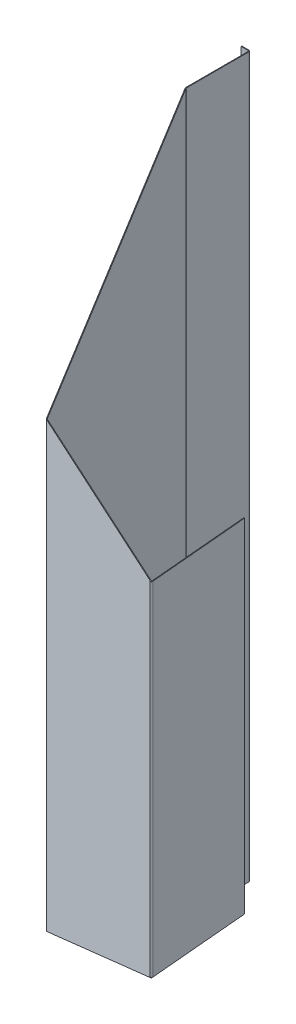
ISO-10303-21;
HEADER;
FILE_DESCRIPTION(('STEP AP214'),'2;1');
FILE_NAME('part.step','',(''),(''),'','','');
FILE_SCHEMA(('AUTOMOTIVE_DESIGN { 1 0 10303 214 1 1 1 1 }'));
ENDSEC;
DATA;
#1=APPLICATION_CONTEXT('core data for automotive mechanical design processes');
#2=APPLICATION_PROTOCOL_DEFINITION('international standard','automotive_design',2000,#1);
#3=PRODUCT_CONTEXT('',#1,'mechanical');
#4=PRODUCT('Part','Part','',(#3));
#5=PRODUCT_RELATED_PRODUCT_CATEGORY('part','',(#4));
#6=PRODUCT_DEFINITION_FORMATION('','',#4);
#7=PRODUCT_DEFINITION_CONTEXT('part definition',#1,'design');
#8=PRODUCT_DEFINITION('design','',#6,#7);
#9=PRODUCT_DEFINITION_SHAPE('','',#8);
#10=(LENGTH_UNIT() NAMED_UNIT(*) SI_UNIT(.MILLI.,.METRE.));
#11=(NAMED_UNIT(*) PLANE_ANGLE_UNIT() SI_UNIT($,.RADIAN.));
#12=(NAMED_UNIT(*) SI_UNIT($,.STERADIAN.) SOLID_ANGLE_UNIT());
#13=UNCERTAINTY_MEASURE_WITH_UNIT(LENGTH_MEASURE(1.E-05),#10,'distance_accuracy_value','');
#14=(GEOMETRIC_REPRESENTATION_CONTEXT(3) GLOBAL_UNCERTAINTY_ASSIGNED_CONTEXT((#13)) GLOBAL_UNIT_ASSIGNED_CONTEXT((#10,
#11,#12)) REPRESENTATION_CONTEXT('',''));
#15=CARTESIAN_POINT('',(0.,0.,0.));
#16=DIRECTION('',(0.,0.,1.));
#17=DIRECTION('',(1.,0.,0.));
#18=AXIS2_PLACEMENT_3D('',#15,#16,#17);
#19=CARTESIAN_POINT('',(-75.030539026034,0.,-1709.11553850912));
#20=DIRECTION('',(0.,-1.,0.));
#21=DIRECTION('',(0.,0.,-1.));
#22=AXIS2_PLACEMENT_3D('',#19,#20,#21);
#23=PLANE('',#22);
#24=DIRECTION('',(0.,0.,1.));
#25=VECTOR('',#24,1.);
#26=CARTESIAN_POINT('',(-75.1270308327766,0.,-1784.52170915387));
#27=LINE('',#26,#25);
#28=CARTESIAN_POINT('',(-75.1270308327765,0.,-1782.92170915387));
#29=VERTEX_POINT('',#28);
#30=CARTESIAN_POINT('',(-75.1270308327766,0.,-1709.66277073844));
#31=VERTEX_POINT('',#30);
#32=EDGE_CURVE('E418',#29,#31,#27,.T.);
#33=ORIENTED_EDGE('',*,*,#32,.F.);
#34=DIRECTION('',(1.,0.,0.));
#35=VECTOR('',#34,1.);
#36=CARTESIAN_POINT('',(-75.1270308327765,0.,-1782.92170915387));
#37=LINE('',#36,#35);
#38=CARTESIAN_POINT('',(-74.3270308327765,0.,-1782.92170915387));
#39=VERTEX_POINT('',#38);
#40=EDGE_CURVE('E279',#29,#39,#37,.T.);
#41=ORIENTED_EDGE('',*,*,#40,.T.);
#42=DIRECTION('',(0.,0.,1.));
#43=VECTOR('',#42,1.);
#44=CARTESIAN_POINT('',(-74.3270308327766,0.,-1784.52170915387));
#45=LINE('',#44,#43);
#46=CARTESIAN_POINT('',(-74.3270308327766,0.,-1709.66277073844));
#47=VERTEX_POINT('',#46);
#48=EDGE_CURVE('E416',#39,#47,#45,.T.);
#49=ORIENTED_EDGE('',*,*,#48,.T.);
#50=DIRECTION('',(-1.,0.,0.));
#51=VECTOR('',#50,1.);
#52=CARTESIAN_POINT('',(-74.3270308327766,0.,-1709.66277073844));
#53=LINE('',#52,#51);
#54=EDGE_CURVE('E447',#47,#31,#53,.T.);
#55=ORIENTED_EDGE('',*,*,#54,.T.);
#56=EDGE_LOOP('',(#33,#41,#49,#55));
#57=FACE_BOUND('',#56,.T.);
#58=ADVANCED_FACE('F74',(#57),#23,.T.);
#59=CARTESIAN_POINT('',(-74.3270308327766,840.,-1784.52170915387));
#60=DIRECTION('',(1.,0.,0.));
#61=DIRECTION('',(0.,0.,-1.));
#62=AXIS2_PLACEMENT_3D('',#59,#60,#61);
#63=PLANE('',#62);
#64=ORIENTED_EDGE('',*,*,#48,.F.);
#65=DIRECTION('',(0.,-1.,0.));
#66=VECTOR('',#65,1.);
#67=CARTESIAN_POINT('',(-74.3270308327765,1.11022302462516E-13,-1782.92170915387));
#68=LINE('',#67,#66);
#69=CARTESIAN_POINT('',(-74.3270308327766,840.,-1782.92170915387));
#70=VERTEX_POINT('',#69);
#71=EDGE_CURVE('E272',#39,#70,#68,.F.);
#72=ORIENTED_EDGE('',*,*,#71,.T.);
#73=DIRECTION('',(0.,0.,1.));
#74=VECTOR('',#73,1.);
#75=CARTESIAN_POINT('',(-74.3270308327766,840.,-1784.52170915387));
#76=LINE('',#75,#74);
#77=CARTESIAN_POINT('',(-74.3270308327766,840.,-1709.66277073844));
#78=VERTEX_POINT('',#77);
#79=EDGE_CURVE('E405',#70,#78,#76,.T.);
#80=ORIENTED_EDGE('',*,*,#79,.T.);
#81=DIRECTION('',(0.,-1.,0.));
#82=VECTOR('',#81,1.);
#83=CARTESIAN_POINT('',(-74.3270308327766,840.,-1709.66277073844));
#84=LINE('',#83,#82);
#85=EDGE_CURVE('E433',#78,#47,#84,.T.);
#86=ORIENTED_EDGE('',*,*,#85,.T.);
#87=EDGE_LOOP('',(#64,#72,#80,#86));
#88=FACE_BOUND('',#87,.T.);
#89=ADVANCED_FACE('F488',(#88),#63,.T.);
#90=CARTESIAN_POINT('',(-75.1270308327766,840.,-1784.52170915387));
#91=DIRECTION('',(1.,0.,0.));
#92=DIRECTION('',(0.,0.,-1.));
#93=AXIS2_PLACEMENT_3D('',#90,#91,#92);
#94=PLANE('',#93);
#95=DIRECTION('',(0.,-1.,0.));
#96=VECTOR('',#95,1.);
#97=CARTESIAN_POINT('',(-75.1270308327765,1.11022302462516E-13,-1782.92170915387));
#98=LINE('',#97,#96);
#99=CARTESIAN_POINT('',(-75.1270308327765,840.,-1782.92170915387));
#100=VERTEX_POINT('',#99);
#101=EDGE_CURVE('E285',#29,#100,#98,.F.);
#102=ORIENTED_EDGE('',*,*,#101,.F.);
#103=ORIENTED_EDGE('',*,*,#32,.T.);
#104=DIRECTION('',(0.,-1.,0.));
#105=VECTOR('',#104,1.);
#106=CARTESIAN_POINT('',(-75.1270308327766,840.,-1709.66277073844));
#107=LINE('',#106,#105);
#108=CARTESIAN_POINT('',(-75.1270308327766,840.,-1709.66277073844));
#109=VERTEX_POINT('',#108);
#110=EDGE_CURVE('E430',#109,#31,#107,.T.);
#111=ORIENTED_EDGE('',*,*,#110,.F.);
#112=DIRECTION('',(0.,0.,1.));
#113=VECTOR('',#112,1.);
#114=CARTESIAN_POINT('',(-75.1270308327766,840.,-1784.52170915387));
#115=LINE('',#114,#113);
#116=EDGE_CURVE('E408',#100,#109,#115,.T.);
#117=ORIENTED_EDGE('',*,*,#116,.F.);
#118=EDGE_LOOP('',(#102,#103,#111,#117));
#119=FACE_BOUND('',#118,.T.);
#120=ADVANCED_FACE('F496',(#119),#94,.F.);
#121=CARTESIAN_POINT('',(19.176253387553,840.,-1454.9625906338));
#122=DIRECTION('',(0.,-1.,0.));
#123=DIRECTION('',(0.,0.,-1.));
#124=AXIS2_PLACEMENT_3D('',#121,#122,#123);
#125=PLANE('',#124);
#126=DIRECTION('',(1.,2.7755575615632E-13,0.));
#127=VECTOR('',#126,1.);
#128=CARTESIAN_POINT('',(-75.1270308327765,840.,-1782.92170915387));
#129=LINE('',#128,#127);
#130=EDGE_CURVE('E290',#100,#70,#129,.T.);
#131=ORIENTED_EDGE('',*,*,#130,.F.);
#132=ORIENTED_EDGE('',*,*,#116,.T.);
#133=DIRECTION('',(1.,0.,0.));
#134=VECTOR('',#133,1.);
#135=CARTESIAN_POINT('',(-75.1270308327766,840.,-1709.66277073844));
#136=LINE('',#135,#134);
#137=EDGE_CURVE('E449',#109,#78,#136,.T.);
#138=ORIENTED_EDGE('',*,*,#137,.T.);
#139=ORIENTED_EDGE('',*,*,#79,.F.);
#140=EDGE_LOOP('',(#131,#132,#138,#139));
#141=FACE_BOUND('',#140,.T.);
#142=ADVANCED_FACE('F490',(#141),#125,.F.);
#143=CARTESIAN_POINT('',(185.672969167223,219.705065737132,-1409.52170915387));
#144=DIRECTION('',(0.,1.,0.));
#145=DIRECTION('',(0.,0.,1.));
#146=AXIS2_PLACEMENT_3D('',#143,#144,#145);
#147=PLANE('',#146);
#148=DIRECTION('',(-0.965925826289069,0.,-0.258819045102519));
#149=VECTOR('',#148,1.);
#150=CARTESIAN_POINT('',(185.672969167223,219.705065737132,-1409.52170915387));
#151=LINE('',#150,#149);
#152=CARTESIAN_POINT('',(185.672969167223,219.705065737132,-1409.52170915387));
#153=VERTEX_POINT('',#152);
#154=CARTESIAN_POINT('',(185.085473783066,219.705065737132,-1409.67912806762));
#155=VERTEX_POINT('',#154);
#156=EDGE_CURVE('E343',#153,#155,#151,.T.);
#157=ORIENTED_EDGE('',*,*,#156,.T.);
#158=CARTESIAN_POINT('',(183.954102933167,219.705065737132,-1410.81049891751));
#159=DIRECTION('',(0.,-1.,0.));
#160=DIRECTION('',(0.,0.,-1.));
#161=AXIS2_PLACEMENT_3D('',#158,#159,#160);
#162=CIRCLE('',#161,1.60000000000001);
#163=CARTESIAN_POINT('',(183.539992461003,219.705065737132,-1409.26501759545));
#164=VERTEX_POINT('',#163);
#165=EDGE_CURVE('E13',#155,#164,#162,.T.);
#166=ORIENTED_EDGE('',*,*,#165,.T.);
#167=DIRECTION('',(0.965925826289068,0.,0.258819045102521));
#168=VECTOR('',#167,1.);
#169=CARTESIAN_POINT('',(18.3598795886345,219.705065737132,-1453.52489544528));
#170=LINE('',#169,#168);
#171=CARTESIAN_POINT('',(185.465913931141,219.705065737132,-1408.74896849284));
#172=VERTEX_POINT('',#171);
#173=EDGE_CURVE('E345',#164,#172,#170,.T.);
#174=ORIENTED_EDGE('',*,*,#173,.T.);
#175=DIRECTION('',(-0.258819045102521,0.,0.965925826289068));
#176=VECTOR('',#175,1.);
#177=CARTESIAN_POINT('',(185.465913931141,219.705065737132,-1408.74896849284));
#178=LINE('',#177,#176);
#179=EDGE_CURVE('E364',#172,#153,#178,.F.);
#180=ORIENTED_EDGE('',*,*,#179,.T.);
#181=EDGE_LOOP('',(#157,#166,#174,#180));
#182=FACE_BOUND('',#181,.T.);
#183=ADVANCED_FACE('F621',(#182),#147,.T.);
#184=CARTESIAN_POINT('',(183.747047697085,620.294934262868,-1410.03775825648));
#185=DIRECTION('',(0.,-1.,0.));
#186=DIRECTION('',(0.,0.,-1.));
#187=AXIS2_PLACEMENT_3D('',#184,#185,#186);
#188=PLANE('',#187);
#189=DIRECTION('',(-0.965925826289068,0.,-0.258819045102521));
#190=VECTOR('',#189,1.);
#191=CARTESIAN_POINT('',(18.3598795886345,620.294934262868,-1453.52489544528));
#192=LINE('',#191,#190);
#193=CARTESIAN_POINT('',(185.465913931141,620.294934262868,-1408.74896849284));
#194=VERTEX_POINT('',#193);
#195=CARTESIAN_POINT('',(183.539992461003,620.294934262868,-1409.26501759545));
#196=VERTEX_POINT('',#195);
#197=EDGE_CURVE('E350',#194,#196,#192,.T.);
#198=ORIENTED_EDGE('',*,*,#197,.T.);
#199=CARTESIAN_POINT('',(183.954102933167,620.294934262868,-1410.81049891751));
#200=DIRECTION('',(0.,-1.,0.));
#201=DIRECTION('',(0.,0.,-1.));
#202=AXIS2_PLACEMENT_3D('',#199,#200,#201);
#203=CIRCLE('',#202,1.60000000000001);
#204=CARTESIAN_POINT('',(185.085473783066,620.294934262868,-1409.67912806762));
#205=VERTEX_POINT('',#204);
#206=EDGE_CURVE('E330',#196,#205,#203,.F.);
#207=ORIENTED_EDGE('',*,*,#206,.T.);
#208=DIRECTION('',(0.96592582628907,0.,0.258819045102515));
#209=VECTOR('',#208,1.);
#210=CARTESIAN_POINT('',(183.747047697085,620.294934262868,-1410.03775825648));
#211=LINE('',#210,#209);
#212=CARTESIAN_POINT('',(185.672969167223,620.294934262868,-1409.52170915387));
#213=VERTEX_POINT('',#212);
#214=EDGE_CURVE('E332',#205,#213,#211,.T.);
#215=ORIENTED_EDGE('',*,*,#214,.T.);
#216=DIRECTION('',(-0.258819045102521,0.,0.965925826289068));
#217=VECTOR('',#216,1.);
#218=CARTESIAN_POINT('',(185.465913931141,620.294934262868,-1408.74896849284));
#219=LINE('',#218,#217);
#220=EDGE_CURVE('E386',#194,#213,#219,.F.);
#221=ORIENTED_EDGE('',*,*,#220,.F.);
#222=EDGE_LOOP('',(#198,#207,#215,#221));
#223=FACE_BOUND('',#222,.T.);
#224=ADVANCED_FACE('F571',(#223),#188,.T.);
#225=CARTESIAN_POINT('',(18.3598795886345,840.,-1453.52489544528));
#226=DIRECTION('',(0.258819045102521,0.,-0.965925826289068));
#227=DIRECTION('',(-0.965925826289068,0.,-0.258819045102521));
#228=AXIS2_PLACEMENT_3D('',#225,#226,#227);
#229=PLANE('',#228);
#230=ORIENTED_EDGE('',*,*,#173,.F.);
#231=DIRECTION('',(0.,-1.,0.));
#232=VECTOR('',#231,1.);
#233=CARTESIAN_POINT('',(183.539992461003,219.705065737132,-1409.26501759545));
#234=LINE('',#233,#232);
#235=EDGE_CURVE('E327',#164,#196,#234,.F.);
#236=ORIENTED_EDGE('',*,*,#235,.T.);
#237=ORIENTED_EDGE('',*,*,#197,.F.);
#238=DIRECTION('',(-0.914692580434131,0.321353103688198,-0.245091138250065));
#239=VECTOR('',#238,1.);
#240=CARTESIAN_POINT('',(-28.9633981463132,695.629015277399,-1466.20512949756));
#241=LINE('',#240,#239);
#242=CARTESIAN_POINT('',(18.762142915389,678.861905678568,-1453.41710931174));
#243=VERTEX_POINT('',#242);
#244=EDGE_CURVE('E381',#194,#243,#241,.T.);
#245=ORIENTED_EDGE('',*,*,#244,.T.);
#246=DIRECTION('',(0.,-1.,0.));
#247=VECTOR('',#246,1.);
#248=CARTESIAN_POINT('',(18.762142915389,840.,-1453.41710931174));
#249=LINE('',#248,#247);
#250=CARTESIAN_POINT('',(18.762142915389,161.138094321432,-1453.41710931174));
#251=VERTEX_POINT('',#250);
#252=EDGE_CURVE('E413',#243,#251,#249,.T.);
#253=ORIENTED_EDGE('',*,*,#252,.T.);
#254=DIRECTION('',(0.914692580434131,0.321353103688198,0.245091138250065));
#255=VECTOR('',#254,1.);
#256=CARTESIAN_POINT('',(217.94561355387,231.115951212633,-1400.04605920853));
#257=LINE('',#256,#255);
#258=EDGE_CURVE('E356',#251,#172,#257,.T.);
#259=ORIENTED_EDGE('',*,*,#258,.T.);
#260=EDGE_LOOP('',(#230,#236,#237,#245,#253,#259));
#261=FACE_BOUND('',#260,.T.);
#262=ADVANCED_FACE('F536',(#261),#229,.F.);
#263=CARTESIAN_POINT('',(18.5669348247165,840.,-1454.29763610632));
#264=DIRECTION('',(0.25881904510252,0.,-0.965925826289068));
#265=DIRECTION('',(-0.965925826289069,0.,-0.258819045102521));
#266=AXIS2_PLACEMENT_3D('',#263,#264,#265);
#267=PLANE('',#266);
#268=DIRECTION('',(0.,-1.,0.));
#269=VECTOR('',#268,1.);
#270=CARTESIAN_POINT('',(183.747047697085,219.705065737132,-1410.03775825648));
#271=LINE('',#270,#269);
#272=CARTESIAN_POINT('',(183.747047697085,219.705065737132,-1410.03775825648));
#273=VERTEX_POINT('',#272);
#274=CARTESIAN_POINT('',(183.747047697086,620.294934262868,-1410.03775825648));
#275=VERTEX_POINT('',#274);
#276=EDGE_CURVE('E338',#273,#275,#271,.F.);
#277=ORIENTED_EDGE('',*,*,#276,.F.);
#278=EDGE_CURVE('E91',#155,#273,#151,.T.);
#279=ORIENTED_EDGE('',*,*,#278,.F.);
#280=ORIENTED_EDGE('',*,*,#156,.F.);
#281=DIRECTION('',(0.914692580434131,0.321353103688198,0.245091138250065));
#282=VECTOR('',#281,1.);
#283=CARTESIAN_POINT('',(218.152668789952,231.115951212633,-1400.81879986956));
#284=LINE('',#283,#282);
#285=CARTESIAN_POINT('',(18.969198151471,161.138094321432,-1454.18984997277));
#286=VERTEX_POINT('',#285);
#287=EDGE_CURVE('E359',#286,#153,#284,.T.);
#288=ORIENTED_EDGE('',*,*,#287,.F.);
#289=DIRECTION('',(0.,-1.,0.));
#290=VECTOR('',#289,1.);
#291=CARTESIAN_POINT('',(18.9691981514711,840.,-1454.18984997277));
#292=LINE('',#291,#290);
#293=CARTESIAN_POINT('',(18.9691981514711,678.861905678568,-1454.18984997277));
#294=VERTEX_POINT('',#293);
#295=EDGE_CURVE('E442',#294,#286,#292,.T.);
#296=ORIENTED_EDGE('',*,*,#295,.F.);
#297=DIRECTION('',(-0.914692580434131,0.321353103688198,-0.245091138250065));
#298=VECTOR('',#297,1.);
#299=CARTESIAN_POINT('',(-28.7563429102312,695.629015277399,-1466.97787015859));
#300=LINE('',#299,#298);
#301=EDGE_CURVE('E384',#213,#294,#300,.T.);
#302=ORIENTED_EDGE('',*,*,#301,.F.);
#303=ORIENTED_EDGE('',*,*,#214,.F.);
#304=EDGE_CURVE('E346',#275,#205,#211,.T.);
#305=ORIENTED_EDGE('',*,*,#304,.F.);
#306=EDGE_LOOP('',(#277,#279,#280,#288,#296,#302,#303,#305));
#307=FACE_BOUND('',#306,.T.);
#308=ADVANCED_FACE('F565',(#307),#267,.T.);
#309=CARTESIAN_POINT('',(19.176253387553,840.,-1454.9625906338));
#310=DIRECTION('',(0.,-1.,0.));
#311=DIRECTION('',(0.,0.,-1.));
#312=AXIS2_PLACEMENT_3D('',#309,#310,#311);
#313=CYLINDRICAL_SURFACE('',#312,0.8);
#314=ORIENTED_EDGE('',*,*,#295,.T.);
#315=CARTESIAN_POINT('',(19.176253387553,160.362661246417,-1454.9625906338));
#316=DIRECTION('',(-0.261228664422713,0.64547485777246,-0.7177198568157));
#317=DIRECTION('',(-0.220765403368467,-0.763781518487861,-0.606547960751609));
#318=AXIS2_PLACEMENT_3D('',#315,#316,#317);
#319=ELLIPSE('',#318,1.23939761613756,0.8);
#320=CARTESIAN_POINT('',(18.4244992909243,160.362661246417,-1454.68897451914));
#321=VERTEX_POINT('',#320);
#322=EDGE_CURVE('E354',#321,#286,#319,.T.);
#323=ORIENTED_EDGE('',*,*,#322,.F.);
#324=DIRECTION('',(0.,-1.,0.));
#325=VECTOR('',#324,1.);
#326=CARTESIAN_POINT('',(18.4244992909243,840.,-1454.68897451914));
#327=LINE('',#326,#325);
#328=CARTESIAN_POINT('',(18.4244992909243,679.637338753583,-1454.68897451914));
#329=VERTEX_POINT('',#328);
#330=EDGE_CURVE('E439',#329,#321,#327,.T.);
#331=ORIENTED_EDGE('',*,*,#330,.F.);
#332=CARTESIAN_POINT('',(19.176253387553,679.637338753583,-1454.9625906338));
#333=DIRECTION('',(-0.261228664422716,-0.645474857772449,-0.717719856815709));
#334=DIRECTION('',(0.220765403368463,-0.763781518487871,0.606547960751598));
#335=AXIS2_PLACEMENT_3D('',#332,#333,#334);
#336=ELLIPSE('',#335,1.23939761613758,0.8);
#337=EDGE_CURVE('E378',#294,#329,#336,.T.);
#338=ORIENTED_EDGE('',*,*,#337,.F.);
#339=EDGE_LOOP('',(#314,#323,#331,#338));
#340=FACE_BOUND('',#339,.T.);
#341=ADVANCED_FACE('F563',(#340),#313,.F.);
#342=CARTESIAN_POINT('',(-74.3270308327766,840.,-1709.52170915387));
#343=DIRECTION('',(0.939692620785909,0.,-0.342020143325666));
#344=DIRECTION('',(-0.342020143325666,0.,-0.93969262078591));
#345=AXIS2_PLACEMENT_3D('',#342,#343,#344);
#346=PLANE('',#345);
#347=ORIENTED_EDGE('',*,*,#330,.T.);
#348=DIRECTION('',(0.294359537564953,0.509197481019002,0.808746182660822));
#349=VECTOR('',#348,1.);
#350=CARTESIAN_POINT('',(51.5906719004176,217.7351238053,-1363.56566418482));
#351=LINE('',#350,#349);
#352=CARTESIAN_POINT('',(-74.2787849294051,0.,-1709.38915462378));
#353=VERTEX_POINT('',#352);
#354=EDGE_CURVE('E367',#353,#321,#351,.T.);
#355=ORIENTED_EDGE('',*,*,#354,.F.);
#356=DIRECTION('',(0.,-1.,0.));
#357=VECTOR('',#356,1.);
#358=CARTESIAN_POINT('',(-74.2787849294053,840.,-1709.38915462378));
#359=LINE('',#358,#357);
#360=CARTESIAN_POINT('',(-74.2787849294051,840.,-1709.38915462378));
#361=VERTEX_POINT('',#360);
#362=EDGE_CURVE('E436',#361,#353,#359,.T.);
#363=ORIENTED_EDGE('',*,*,#362,.F.);
#364=DIRECTION('',(-0.294359537564953,0.509197481019002,-0.808746182660822));
#365=VECTOR('',#364,1.);
#366=CARTESIAN_POINT('',(-74.3145215348559,840.061818922621,-1709.4873401403));
#367=LINE('',#366,#365);
#368=EDGE_CURVE('E392',#329,#361,#367,.T.);
#369=ORIENTED_EDGE('',*,*,#368,.F.);
#370=EDGE_LOOP('',(#347,#355,#363,#369));
#371=FACE_BOUND('',#370,.T.);
#372=ADVANCED_FACE('F482',(#371),#346,.T.);
#373=CARTESIAN_POINT('',(-75.0787849294053,840.,-1709.24809303921));
#374=DIRECTION('',(0.93969262078591,0.,-0.342020143325666));
#375=DIRECTION('',(-0.342020143325666,0.,-0.939692620785909));
#376=AXIS2_PLACEMENT_3D('',#373,#374,#375);
#377=PLANE('',#376);
#378=DIRECTION('',(0.294359537564953,0.509197481019002,0.808746182660822));
#379=VECTOR('',#378,1.);
#380=CARTESIAN_POINT('',(50.8389178037889,217.7351238053,-1363.29204807016));
#381=LINE('',#380,#379);
#382=CARTESIAN_POINT('',(-75.030539026034,0.,-1709.11553850912));
#383=VERTEX_POINT('',#382);
#384=CARTESIAN_POINT('',(17.6727451942956,160.362661246417,-1454.41535840448));
#385=VERTEX_POINT('',#384);
#386=EDGE_CURVE('E370',#383,#385,#381,.T.);
#387=ORIENTED_EDGE('',*,*,#386,.T.);
#388=DIRECTION('',(0.,-1.,0.));
#389=VECTOR('',#388,1.);
#390=CARTESIAN_POINT('',(17.6727451942956,840.,-1454.41535840448));
#391=LINE('',#390,#389);
#392=CARTESIAN_POINT('',(17.6727451942956,679.637338753583,-1454.41535840448));
#393=VERTEX_POINT('',#392);
#394=EDGE_CURVE('E424',#393,#385,#391,.T.);
#395=ORIENTED_EDGE('',*,*,#394,.F.);
#396=DIRECTION('',(-0.294359537564953,0.509197481019002,-0.808746182660822));
#397=VECTOR('',#396,1.);
#398=CARTESIAN_POINT('',(-75.0662756314846,840.061818922621,-1709.21372402564));
#399=LINE('',#398,#397);
#400=CARTESIAN_POINT('',(-75.0305390260341,840.,-1709.11553850912));
#401=VERTEX_POINT('',#400);
#402=EDGE_CURVE('E395',#393,#401,#399,.T.);
#403=ORIENTED_EDGE('',*,*,#402,.T.);
#404=DIRECTION('',(0.,-1.,0.));
#405=VECTOR('',#404,1.);
#406=CARTESIAN_POINT('',(-75.030539026034,840.,-1709.11553850912));
#407=LINE('',#406,#405);
#408=EDGE_CURVE('E427',#401,#383,#407,.T.);
#409=ORIENTED_EDGE('',*,*,#408,.T.);
#410=EDGE_LOOP('',(#387,#395,#403,#409));
#411=FACE_BOUND('',#410,.T.);
#412=ADVANCED_FACE('F465',(#411),#377,.F.);
#413=CARTESIAN_POINT('',(19.176253387553,840.,-1454.9625906338));
#414=DIRECTION('',(0.,-1.,0.));
#415=DIRECTION('',(0.,0.,-1.));
#416=AXIS2_PLACEMENT_3D('',#413,#414,#415);
#417=CYLINDRICAL_SURFACE('',#416,1.6);
#418=CARTESIAN_POINT('',(19.176253387553,160.362661246417,-1454.9625906338));
#419=DIRECTION('',(-0.174155795439187,0.860649711162389,-0.478489115436329));
#420=DIRECTION('',(-0.294359537564953,-0.509197481019002,-0.808746182660822));
#421=AXIS2_PLACEMENT_3D('',#418,#419,#420);
#422=ELLIPSE('',#421,1.85906063668928,1.6);
#423=EDGE_CURVE('E353',#385,#251,#422,.T.);
#424=ORIENTED_EDGE('',*,*,#423,.T.);
#425=ORIENTED_EDGE('',*,*,#252,.F.);
#426=CARTESIAN_POINT('',(19.176253387553,679.637338753583,-1454.9625906338));
#427=DIRECTION('',(-0.174155795439187,-0.860649711162389,-0.478489115436329));
#428=DIRECTION('',(0.294359537564953,-0.509197481019002,0.808746182660822));
#429=AXIS2_PLACEMENT_3D('',#426,#427,#428);
#430=ELLIPSE('',#429,1.85906063668928,1.6);
#431=EDGE_CURVE('E377',#243,#393,#430,.T.);
#432=ORIENTED_EDGE('',*,*,#431,.T.);
#433=ORIENTED_EDGE('',*,*,#394,.T.);
#434=EDGE_LOOP('',(#424,#425,#432,#433));
#435=FACE_BOUND('',#434,.T.);
#436=ADVANCED_FACE('F544',(#435),#417,.T.);
#437=CARTESIAN_POINT('',(-74.2787849294053,840.,-1709.38915462378));
#438=DIRECTION('',(0.,1.,0.));
#439=DIRECTION('',(0.,0.,1.));
#440=AXIS2_PLACEMENT_3D('',#437,#438,#439);
#441=PLANE('',#440);
#442=DIRECTION('',(-0.939692620785886,0.,0.342020143325731));
#443=VECTOR('',#442,1.);
#444=CARTESIAN_POINT('',(-74.2787849294053,840.,-1709.38915462378));
#445=LINE('',#444,#443);
#446=EDGE_CURVE('E78',#361,#401,#445,.T.);
#447=ORIENTED_EDGE('',*,*,#446,.F.);
#448=CARTESIAN_POINT('',(-73.5270308327766,840.,-1709.66277073844));
#449=DIRECTION('',(0.,-1.,0.));
#450=DIRECTION('',(0.,0.,-1.));
#451=AXIS2_PLACEMENT_3D('',#448,#449,#450);
#452=CIRCLE('',#451,0.8);
#453=EDGE_CURVE('E402',#78,#361,#452,.F.);
#454=ORIENTED_EDGE('',*,*,#453,.F.);
#455=ORIENTED_EDGE('',*,*,#137,.F.);
#456=CARTESIAN_POINT('',(-73.5270308327766,840.,-1709.66277073844));
#457=DIRECTION('',(0.,1.,0.));
#458=DIRECTION('',(1.,0.,0.));
#459=AXIS2_PLACEMENT_3D('',#456,#457,#458);
#460=CIRCLE('',#459,1.6);
#461=EDGE_CURVE('E410',#109,#401,#460,.T.);
#462=ORIENTED_EDGE('',*,*,#461,.T.);
#463=EDGE_LOOP('',(#447,#454,#455,#462));
#464=FACE_BOUND('',#463,.T.);
#465=ADVANCED_FACE('F76',(#464),#441,.T.);
#466=CARTESIAN_POINT('',(-74.3270308327766,0.,-1709.66277073844));
#467=DIRECTION('',(0.,-1.,0.));
#468=DIRECTION('',(0.,0.,-1.));
#469=AXIS2_PLACEMENT_3D('',#466,#467,#468);
#470=PLANE('',#469);
#471=ORIENTED_EDGE('',*,*,#54,.F.);
#472=CARTESIAN_POINT('',(-73.5270308327766,0.,-1709.66277073844));
#473=DIRECTION('',(0.,-1.,0.));
#474=DIRECTION('',(0.,0.,-1.));
#475=AXIS2_PLACEMENT_3D('',#472,#473,#474);
#476=CIRCLE('',#475,0.8);
#477=EDGE_CURVE('E401',#47,#353,#476,.F.);
#478=ORIENTED_EDGE('',*,*,#477,.T.);
#479=DIRECTION('',(0.939692620785886,0.,-0.342020143325731));
#480=VECTOR('',#479,1.);
#481=CARTESIAN_POINT('',(-75.030539026034,0.,-1709.11553850912));
#482=LINE('',#481,#480);
#483=EDGE_CURVE('E445',#383,#353,#482,.T.);
#484=ORIENTED_EDGE('',*,*,#483,.F.);
#485=CARTESIAN_POINT('',(-73.5270308327766,0.,-1709.66277073844));
#486=DIRECTION('',(0.,1.,0.));
#487=DIRECTION('',(1.,0.,0.));
#488=AXIS2_PLACEMENT_3D('',#485,#486,#487);
#489=CIRCLE('',#488,1.6);
#490=EDGE_CURVE('E406',#31,#383,#489,.T.);
#491=ORIENTED_EDGE('',*,*,#490,.F.);
#492=EDGE_LOOP('',(#471,#478,#484,#491));
#493=FACE_BOUND('',#492,.T.);
#494=ADVANCED_FACE('F475',(#493),#470,.T.);
#495=CARTESIAN_POINT('',(-73.5270308327766,840.,-1709.66277073844));
#496=DIRECTION('',(0.,-1.,0.));
#497=DIRECTION('',(0.,0.,-1.));
#498=AXIS2_PLACEMENT_3D('',#495,#496,#497);
#499=CYLINDRICAL_SURFACE('',#498,0.8);
#500=ORIENTED_EDGE('',*,*,#477,.F.);
#501=ORIENTED_EDGE('',*,*,#85,.F.);
#502=ORIENTED_EDGE('',*,*,#453,.T.);
#503=ORIENTED_EDGE('',*,*,#362,.T.);
#504=EDGE_LOOP('',(#500,#501,#502,#503));
#505=FACE_BOUND('',#504,.T.);
#506=ADVANCED_FACE('F485',(#505),#499,.F.);
#507=CARTESIAN_POINT('',(-73.5270308327766,840.,-1709.66277073844));
#508=DIRECTION('',(0.,-1.,0.));
#509=DIRECTION('',(0.,0.,-1.));
#510=AXIS2_PLACEMENT_3D('',#507,#508,#509);
#511=CYLINDRICAL_SURFACE('',#510,1.6);
#512=ORIENTED_EDGE('',*,*,#490,.T.);
#513=ORIENTED_EDGE('',*,*,#408,.F.);
#514=ORIENTED_EDGE('',*,*,#461,.F.);
#515=ORIENTED_EDGE('',*,*,#110,.T.);
#516=EDGE_LOOP('',(#512,#513,#514,#515));
#517=FACE_BOUND('',#516,.T.);
#518=ADVANCED_FACE('F470',(#517),#511,.T.);
#519=CARTESIAN_POINT('',(-74.3145215348559,840.061818922621,-1709.4873401403));
#520=DIRECTION('',(-0.174155795439187,-0.860649711162389,-0.478489115436329));
#521=DIRECTION('',(-0.294359537564953,0.509197481019002,-0.808746182660822));
#522=AXIS2_PLACEMENT_3D('',#519,#520,#521);
#523=PLANE('',#522);
#524=ORIENTED_EDGE('',*,*,#368,.T.);
#525=ORIENTED_EDGE('',*,*,#446,.T.);
#526=ORIENTED_EDGE('',*,*,#402,.F.);
#527=DIRECTION('',(0.939692620785909,0.,-0.342020143325666));
#528=VECTOR('',#527,1.);
#529=CARTESIAN_POINT('',(18.4244992909243,679.637338753583,-1454.68897451914));
#530=LINE('',#529,#528);
#531=EDGE_CURVE('E398',#329,#393,#530,.F.);
#532=ORIENTED_EDGE('',*,*,#531,.F.);
#533=EDGE_LOOP('',(#524,#525,#526,#532));
#534=FACE_BOUND('',#533,.T.);
#535=ADVANCED_FACE('F458',(#534),#523,.F.);
#536=CARTESIAN_POINT('',(-28.9633981463132,695.629015277399,-1466.20512949756));
#537=DIRECTION('',(-0.31040326221058,-0.94695944092129,-0.0831723034373107));
#538=DIRECTION('',(-0.914692580434131,0.321353103688198,-0.245091138250065));
#539=AXIS2_PLACEMENT_3D('',#536,#537,#538);
#540=PLANE('',#539);
#541=DIRECTION('',(-0.258819045102521,0.,0.965925826289068));
#542=VECTOR('',#541,1.);
#543=CARTESIAN_POINT('',(18.762142915389,678.861905678568,-1453.41710931174));
#544=LINE('',#543,#542);
#545=EDGE_CURVE('E389',#243,#294,#544,.F.);
#546=ORIENTED_EDGE('',*,*,#545,.F.);
#547=ORIENTED_EDGE('',*,*,#244,.F.);
#548=ORIENTED_EDGE('',*,*,#220,.T.);
#549=ORIENTED_EDGE('',*,*,#301,.T.);
#550=EDGE_LOOP('',(#546,#547,#548,#549));
#551=FACE_BOUND('',#550,.T.);
#552=ADVANCED_FACE('F608',(#551),#540,.F.);
#553=CARTESIAN_POINT('',(19.4498695022136,678.69070976032,-1454.21083653717));
#554=CARTESIAN_POINT('',(19.5410748737671,678.69070976032,-1453.96025183829));
#555=CARTESIAN_POINT('',(19.6322802453206,678.69070976032,-1453.70966713942));
#556=CARTESIAN_POINT('',(19.7234856168741,678.69070976032,-1453.45908244054));
#557=CARTESIAN_POINT('',(17.9463613089561,678.69070976032,-1453.66360430785));
#558=CARTESIAN_POINT('',(17.5363972827571,678.69070976032,-1453.23060886587));
#559=CARTESIAN_POINT('',(17.1264332565582,678.69070976032,-1452.79761342388));
#560=CARTESIAN_POINT('',(16.7164692303592,678.69070976032,-1452.3646179819));
#561=CARTESIAN_POINT('',(17.3991290796351,680.583967746847,-1455.16711250111));
#562=CARTESIAN_POINT('',(16.8067543103291,680.583967746848,-1455.23528645688));
#563=CARTESIAN_POINT('',(16.2143795410231,680.583967746848,-1455.30346041265));
#564=CARTESIAN_POINT('',(15.6220047717171,680.583967746847,-1455.37163436841));
#565=CARTESIAN_POINT('',(18.9026372728925,680.583967746847,-1455.71434473043));
#566=CARTESIAN_POINT('',(18.811431901339,680.583967746847,-1455.9649294293));
#567=CARTESIAN_POINT('',(18.7202265297855,680.583967746847,-1456.21551412818));
#568=CARTESIAN_POINT('',(18.629021158232,680.583967746847,-1456.46609882706));
#569=CARTESIAN_POINT('',(20.40614546615,680.583967746847,-1456.26157695975));
#570=CARTESIAN_POINT('',(20.816109492349,680.583967746848,-1456.69457240173));
#571=CARTESIAN_POINT('',(21.2260735185479,680.583967746848,-1457.12756784372));
#572=CARTESIAN_POINT('',(21.6360375447469,680.583967746847,-1457.5605632857));
#573=CARTESIAN_POINT('',(20.953377695471,678.69070976032,-1454.75806876649));
#574=CARTESIAN_POINT('',(21.545752464777,678.69070976032,-1454.68989481072));
#575=CARTESIAN_POINT('',(22.138127234083,678.69070976032,-1454.62172085495));
#576=CARTESIAN_POINT('',(22.730502003389,678.69070976032,-1454.55354689918));
#577=CARTESIAN_POINT('',(19.4498695022136,678.69070976032,-1454.21083653717));
#578=CARTESIAN_POINT('',(19.5410748737671,678.69070976032,-1453.96025183829));
#579=CARTESIAN_POINT('',(19.6322802453206,678.69070976032,-1453.70966713942));
#580=CARTESIAN_POINT('',(19.7234856168741,678.69070976032,-1453.45908244054));
#581=(BOUNDED_SURFACE() B_SPLINE_SURFACE(3,3,((#553,#554,#555,#556),(#557,#558,#559,#560),(#561,
#562,#563,#564),(#565,#566,#567,#568),(#569,#570,#571,#572),(#573,#574,#575,#576),(#577,#578,
#579,#580)),.UNSPECIFIED.,.T.,.F.,.F.) B_SPLINE_SURFACE_WITH_KNOTS((4,3,4),(4,4),(0.,0.5,1.),
(0.,1.),.UNSPECIFIED.) GEOMETRIC_REPRESENTATION_ITEM() RATIONAL_B_SPLINE_SURFACE(((1.,1.,1.,1.),
(0.333333333333333,0.333333333333333,0.333333333333333,0.333333333333333),(0.333333333333333,
0.333333333333333,0.333333333333333,0.333333333333333),(1.,1.,1.,1.),(0.333333333333333,
0.333333333333333,0.333333333333333,0.333333333333333),(0.333333333333333,0.333333333333333,
0.333333333333333,0.333333333333333),(1.,1.,1.,1.))) REPRESENTATION_ITEM('') SURFACE());
#582=ORIENTED_EDGE('',*,*,#531,.T.);
#583=ORIENTED_EDGE('',*,*,#431,.F.);
#584=ORIENTED_EDGE('',*,*,#545,.T.);
#585=ORIENTED_EDGE('',*,*,#337,.T.);
#586=EDGE_LOOP('',(#582,#583,#584,#585));
#587=FACE_BOUND('',#586,.T.);
#588=ADVANCED_FACE('F614',(#587),#581,.T.);
#589=CARTESIAN_POINT('',(51.5906719004176,217.7351238053,-1363.56566418482));
#590=DIRECTION('',(-0.174155795439187,0.860649711162389,-0.478489115436329));
#591=DIRECTION('',(0.294359537564953,0.509197481019002,0.808746182660822));
#592=AXIS2_PLACEMENT_3D('',#589,#590,#591);
#593=PLANE('',#592);
#594=ORIENTED_EDGE('',*,*,#354,.T.);
#595=DIRECTION('',(0.939692620785909,0.,-0.342020143325666));
#596=VECTOR('',#595,1.);
#597=CARTESIAN_POINT('',(18.4244992909243,160.362661246417,-1454.68897451914));
#598=LINE('',#597,#596);
#599=EDGE_CURVE('E373',#321,#385,#598,.F.);
#600=ORIENTED_EDGE('',*,*,#599,.T.);
#601=ORIENTED_EDGE('',*,*,#386,.F.);
#602=ORIENTED_EDGE('',*,*,#483,.T.);
#603=EDGE_LOOP('',(#594,#600,#601,#602));
#604=FACE_BOUND('',#603,.T.);
#605=ADVANCED_FACE('F479',(#604),#593,.F.);
#606=CARTESIAN_POINT('',(217.94561355387,231.115951212633,-1400.04605920853));
#607=DIRECTION('',(-0.31040326221058,0.94695944092129,-0.0831723034373107));
#608=DIRECTION('',(0.914692580434131,0.321353103688198,0.245091138250065));
#609=AXIS2_PLACEMENT_3D('',#606,#607,#608);
#610=PLANE('',#609);
#611=ORIENTED_EDGE('',*,*,#179,.F.);
#612=ORIENTED_EDGE('',*,*,#258,.F.);
#613=DIRECTION('',(-0.258819045102521,0.,0.965925826289068));
#614=VECTOR('',#613,1.);
#615=CARTESIAN_POINT('',(18.762142915389,161.138094321432,-1453.41710931174));
#616=LINE('',#615,#614);
#617=EDGE_CURVE('E361',#251,#286,#616,.F.);
#618=ORIENTED_EDGE('',*,*,#617,.T.);
#619=ORIENTED_EDGE('',*,*,#287,.T.);
#620=EDGE_LOOP('',(#611,#612,#618,#619));
#621=FACE_BOUND('',#620,.T.);
#622=ADVANCED_FACE('F620',(#621),#610,.F.);
#623=CARTESIAN_POINT('',(18.9026372728925,159.416032253153,-1455.71434473043));
#624=CARTESIAN_POINT('',(18.811431901339,159.416032253153,-1455.9649294293));
#625=CARTESIAN_POINT('',(18.7202265297855,159.416032253153,-1456.21551412818));
#626=CARTESIAN_POINT('',(18.629021158232,159.416032253153,-1456.46609882706));
#627=CARTESIAN_POINT('',(17.3991290796351,159.416032253153,-1455.16711250111));
#628=CARTESIAN_POINT('',(16.8067543103291,159.416032253153,-1455.23528645688));
#629=CARTESIAN_POINT('',(16.2143795410231,159.416032253153,-1455.30346041265));
#630=CARTESIAN_POINT('',(15.6220047717171,159.416032253153,-1455.37163436841));
#631=CARTESIAN_POINT('',(17.9463613089561,161.30929023968,-1453.66360430785));
#632=CARTESIAN_POINT('',(17.5363972827571,161.30929023968,-1453.23060886587));
#633=CARTESIAN_POINT('',(17.1264332565582,161.30929023968,-1452.79761342388));
#634=CARTESIAN_POINT('',(16.7164692303592,161.30929023968,-1452.3646179819));
#635=CARTESIAN_POINT('',(19.4498695022136,161.30929023968,-1454.21083653717));
#636=CARTESIAN_POINT('',(19.5410748737671,161.30929023968,-1453.96025183829));
#637=CARTESIAN_POINT('',(19.6322802453206,161.30929023968,-1453.70966713942));
#638=CARTESIAN_POINT('',(19.7234856168741,161.30929023968,-1453.45908244054));
#639=CARTESIAN_POINT('',(20.953377695471,161.30929023968,-1454.75806876649));
#640=CARTESIAN_POINT('',(21.545752464777,161.30929023968,-1454.68989481072));
#641=CARTESIAN_POINT('',(22.138127234083,161.30929023968,-1454.62172085495));
#642=CARTESIAN_POINT('',(22.730502003389,161.30929023968,-1454.55354689918));
#643=CARTESIAN_POINT('',(20.40614546615,159.416032253153,-1456.26157695975));
#644=CARTESIAN_POINT('',(20.816109492349,159.416032253153,-1456.69457240173));
#645=CARTESIAN_POINT('',(21.2260735185479,159.416032253153,-1457.12756784372));
#646=CARTESIAN_POINT('',(21.6360375447469,159.416032253153,-1457.5605632857));
#647=CARTESIAN_POINT('',(18.9026372728925,159.416032253153,-1455.71434473043));
#648=CARTESIAN_POINT('',(18.811431901339,159.416032253153,-1455.9649294293));
#649=CARTESIAN_POINT('',(18.7202265297855,159.416032253153,-1456.21551412818));
#650=CARTESIAN_POINT('',(18.629021158232,159.416032253153,-1456.46609882706));
#651=(BOUNDED_SURFACE() B_SPLINE_SURFACE(3,3,((#623,#624,#625,#626),(#627,#628,#629,#630),(#631,
#632,#633,#634),(#635,#636,#637,#638),(#639,#640,#641,#642),(#643,#644,#645,#646),(#647,#648,
#649,#650)),.UNSPECIFIED.,.T.,.F.,.F.) B_SPLINE_SURFACE_WITH_KNOTS((4,3,4),(4,4),(0.,0.5,1.),
(0.,1.),.UNSPECIFIED.) GEOMETRIC_REPRESENTATION_ITEM() RATIONAL_B_SPLINE_SURFACE(((1.,1.,1.,1.),
(0.333333333333333,0.333333333333333,0.333333333333333,0.333333333333333),(0.333333333333333,
0.333333333333333,0.333333333333333,0.333333333333333),(1.,1.,1.,1.),(0.333333333333333,
0.333333333333333,0.333333333333333,0.333333333333333),(0.333333333333333,0.333333333333333,
0.333333333333333,0.333333333333333),(1.,1.,1.,1.))) REPRESENTATION_ITEM('') SURFACE());
#652=ORIENTED_EDGE('',*,*,#617,.F.);
#653=ORIENTED_EDGE('',*,*,#423,.F.);
#654=ORIENTED_EDGE('',*,*,#599,.F.);
#655=ORIENTED_EDGE('',*,*,#322,.T.);
#656=EDGE_LOOP('',(#652,#653,#654,#655));
#657=FACE_BOUND('',#656,.T.);
#658=ADVANCED_FACE('F618',(#657),#651,.T.);
#659=CARTESIAN_POINT('',(183.954102933167,620.294934262868,-1410.81049891751));
#660=DIRECTION('',(0.,1.,0.));
#661=DIRECTION('',(0.,0.,1.));
#662=AXIS2_PLACEMENT_3D('',#659,#660,#661);
#663=PLANE('',#662);
#664=CARTESIAN_POINT('',(183.954102933167,620.294934262868,-1410.81049891751));
#665=DIRECTION('',(0.,-1.,0.));
#666=DIRECTION('',(0.,0.,-1.));
#667=AXIS2_PLACEMENT_3D('',#664,#665,#666);
#668=CIRCLE('',#667,0.80000000000001);
#669=CARTESIAN_POINT('',(184.751058691641,620.294934262868,-1410.88022351171));
#670=VERTEX_POINT('',#669);
#671=EDGE_CURVE('E335',#275,#670,#668,.F.);
#672=ORIENTED_EDGE('',*,*,#671,.F.);
#673=ORIENTED_EDGE('',*,*,#304,.T.);
#674=CARTESIAN_POINT('',(185.548014450114,620.294934262868,-1410.94994810591));
#675=VERTEX_POINT('',#674);
#676=EDGE_CURVE('E329',#205,#675,#203,.F.);
#677=ORIENTED_EDGE('',*,*,#676,.T.);
#678=DIRECTION('',(-0.996194698091746,0.,0.0871557427476558));
#679=VECTOR('',#678,1.);
#680=CARTESIAN_POINT('',(185.548014450114,620.294934262868,-1410.94994810591));
#681=LINE('',#680,#679);
#682=EDGE_CURVE('E293',#670,#675,#681,.F.);
#683=ORIENTED_EDGE('',*,*,#682,.F.);
#684=EDGE_LOOP('',(#672,#673,#677,#683));
#685=FACE_BOUND('',#684,.T.);
#686=ADVANCED_FACE('F635',(#685),#663,.T.);
#687=CARTESIAN_POINT('',(183.954102933167,219.705065737132,-1410.81049891751));
#688=DIRECTION('',(0.,1.,0.));
#689=DIRECTION('',(0.,0.,1.));
#690=AXIS2_PLACEMENT_3D('',#687,#688,#689);
#691=PLANE('',#690);
#692=CARTESIAN_POINT('',(185.548014450114,219.705065737132,-1410.94994810591));
#693=VERTEX_POINT('',#692);
#694=EDGE_CURVE('E84',#693,#155,#162,.T.);
#695=ORIENTED_EDGE('',*,*,#694,.T.);
#696=ORIENTED_EDGE('',*,*,#278,.T.);
#697=CARTESIAN_POINT('',(183.954102933167,219.705065737132,-1410.81049891751));
#698=DIRECTION('',(0.,-1.,0.));
#699=DIRECTION('',(0.,0.,-1.));
#700=AXIS2_PLACEMENT_3D('',#697,#698,#699);
#701=CIRCLE('',#700,0.80000000000001);
#702=CARTESIAN_POINT('',(184.751058691641,219.705065737132,-1410.88022351171));
#703=VERTEX_POINT('',#702);
#704=EDGE_CURVE('E299',#703,#273,#701,.T.);
#705=ORIENTED_EDGE('',*,*,#704,.F.);
#706=DIRECTION('',(-0.996194698091746,0.,0.0871557427476558));
#707=VECTOR('',#706,1.);
#708=CARTESIAN_POINT('',(184.751058691641,219.705065737132,-1410.88022351171));
#709=LINE('',#708,#707);
#710=EDGE_CURVE('E320',#703,#693,#709,.F.);
#711=ORIENTED_EDGE('',*,*,#710,.T.);
#712=EDGE_LOOP('',(#695,#696,#705,#711));
#713=FACE_BOUND('',#712,.T.);
#714=ADVANCED_FACE('F577',(#713),#691,.F.);
#715=CARTESIAN_POINT('',(183.954102933167,219.705065737132,-1410.81049891751));
#716=DIRECTION('',(0.,-1.,0.));
#717=DIRECTION('',(0.996194698091746,0.,-0.0871557427476559));
#718=AXIS2_PLACEMENT_3D('',#715,#716,#717);
#719=CYLINDRICAL_SURFACE('',#718,1.60000000000001);
#720=ORIENTED_EDGE('',*,*,#235,.F.);
#721=ORIENTED_EDGE('',*,*,#165,.F.);
#722=ORIENTED_EDGE('',*,*,#694,.F.);
#723=DIRECTION('',(0.,-1.,0.));
#724=VECTOR('',#723,1.);
#725=CARTESIAN_POINT('',(185.548014450114,620.294934262868,-1410.94994810591));
#726=LINE('',#725,#724);
#727=EDGE_CURVE('E317',#693,#675,#726,.F.);
#728=ORIENTED_EDGE('',*,*,#727,.T.);
#729=ORIENTED_EDGE('',*,*,#676,.F.);
#730=ORIENTED_EDGE('',*,*,#206,.F.);
#731=EDGE_LOOP('',(#720,#721,#722,#728,#729,#730));
#732=FACE_BOUND('',#731,.T.);
#733=ADVANCED_FACE('F600',(#732),#719,.T.);
#734=CARTESIAN_POINT('',(183.954102933167,219.705065737132,-1410.81049891751));
#735=DIRECTION('',(0.,-1.,0.));
#736=DIRECTION('',(0.996194698091746,0.,-0.0871557427476559));
#737=AXIS2_PLACEMENT_3D('',#734,#735,#736);
#738=CYLINDRICAL_SURFACE('',#737,0.80000000000001);
#739=ORIENTED_EDGE('',*,*,#276,.T.);
#740=ORIENTED_EDGE('',*,*,#671,.T.);
#741=DIRECTION('',(0.,-1.,0.));
#742=VECTOR('',#741,1.);
#743=CARTESIAN_POINT('',(184.751058691641,620.294934262868,-1410.88022351171));
#744=LINE('',#743,#742);
#745=EDGE_CURVE('E323',#670,#703,#744,.T.);
#746=ORIENTED_EDGE('',*,*,#745,.T.);
#747=ORIENTED_EDGE('',*,*,#704,.T.);
#748=EDGE_LOOP('',(#739,#740,#746,#747));
#749=FACE_BOUND('',#748,.T.);
#750=ADVANCED_FACE('F579',(#749),#738,.F.);
#751=CARTESIAN_POINT('',(185.647591490339,620.294934262868,-1409.81177732799));
#752=DIRECTION('',(0.,-1.,0.));
#753=DIRECTION('',(1.,0.,0.));
#754=AXIS2_PLACEMENT_3D('',#751,#752,#753);
#755=PLANE('',#754);
#756=ORIENTED_EDGE('',*,*,#682,.T.);
#757=DIRECTION('',(0.0871557427476559,0.,0.996194698091746));
#758=VECTOR('',#757,1.);
#759=CARTESIAN_POINT('',(175.288479400845,620.294934262868,-1528.21697032107));
#760=LINE('',#759,#758);
#761=CARTESIAN_POINT('',(175.288479400845,620.294934262868,-1528.21697032107));
#762=VERTEX_POINT('',#761);
#763=EDGE_CURVE('E307',#762,#675,#760,.T.);
#764=ORIENTED_EDGE('',*,*,#763,.F.);
#765=DIRECTION('',(-0.996194698091746,0.,0.0871557427476557));
#766=VECTOR('',#765,1.);
#767=CARTESIAN_POINT('',(175.288479400845,620.294934262868,-1528.21697032107));
#768=LINE('',#767,#766);
#769=CARTESIAN_POINT('',(174.491523642372,620.294934262868,-1528.14724572687));
#770=VERTEX_POINT('',#769);
#771=EDGE_CURVE('E300',#762,#770,#768,.T.);
#772=ORIENTED_EDGE('',*,*,#771,.T.);
#773=DIRECTION('',(-0.0871557427476559,0.,-0.996194698091746));
#774=VECTOR('',#773,1.);
#775=CARTESIAN_POINT('',(184.850635731866,620.294934262868,-1409.74205273379));
#776=LINE('',#775,#774);
#777=EDGE_CURVE('E314',#770,#670,#776,.F.);
#778=ORIENTED_EDGE('',*,*,#777,.T.);
#779=EDGE_LOOP('',(#756,#764,#772,#778));
#780=FACE_BOUND('',#779,.T.);
#781=ADVANCED_FACE('F586',(#780),#755,.F.);
#782=CARTESIAN_POINT('',(175.288479400845,219.705065737132,-1528.21697032107));
#783=DIRECTION('',(0.,1.,0.));
#784=DIRECTION('',(-1.,0.,0.));
#785=AXIS2_PLACEMENT_3D('',#782,#783,#784);
#786=PLANE('',#785);
#787=ORIENTED_EDGE('',*,*,#710,.F.);
#788=DIRECTION('',(0.0871557427476559,0.,0.996194698091746));
#789=VECTOR('',#788,1.);
#790=CARTESIAN_POINT('',(174.491523642372,219.705065737132,-1528.14724572687));
#791=LINE('',#790,#789);
#792=CARTESIAN_POINT('',(174.491523642372,219.705065737132,-1528.14724572687));
#793=VERTEX_POINT('',#792);
#794=EDGE_CURVE('E312',#703,#793,#791,.F.);
#795=ORIENTED_EDGE('',*,*,#794,.T.);
#796=DIRECTION('',(-0.996194698091746,0.,0.0871557427476557));
#797=VECTOR('',#796,1.);
#798=CARTESIAN_POINT('',(175.288479400845,219.705065737132,-1528.21697032107));
#799=LINE('',#798,#797);
#800=CARTESIAN_POINT('',(175.288479400845,219.705065737132,-1528.21697032107));
#801=VERTEX_POINT('',#800);
#802=EDGE_CURVE('E296',#801,#793,#799,.T.);
#803=ORIENTED_EDGE('',*,*,#802,.F.);
#804=DIRECTION('',(-0.0871557427476559,0.,-0.996194698091746));
#805=VECTOR('',#804,1.);
#806=CARTESIAN_POINT('',(175.288479400845,219.705065737132,-1528.21697032107));
#807=LINE('',#806,#805);
#808=EDGE_CURVE('E305',#693,#801,#807,.T.);
#809=ORIENTED_EDGE('',*,*,#808,.F.);
#810=EDGE_LOOP('',(#787,#795,#803,#809));
#811=FACE_BOUND('',#810,.T.);
#812=ADVANCED_FACE('F593',(#811),#786,.F.);
#813=CARTESIAN_POINT('',(175.288479400845,620.294934262868,-1528.21697032107));
#814=DIRECTION('',(-0.996194698091746,0.,0.0871557427476559));
#815=DIRECTION('',(0.0871557427476559,0.,0.996194698091746));
#816=AXIS2_PLACEMENT_3D('',#813,#814,#815);
#817=PLANE('',#816);
#818=ORIENTED_EDGE('',*,*,#727,.F.);
#819=ORIENTED_EDGE('',*,*,#808,.T.);
#820=DIRECTION('',(0.,1.,0.));
#821=VECTOR('',#820,1.);
#822=CARTESIAN_POINT('',(175.288479400845,620.294934262868,-1528.21697032107));
#823=LINE('',#822,#821);
#824=EDGE_CURVE('E303',#801,#762,#823,.T.);
#825=ORIENTED_EDGE('',*,*,#824,.T.);
#826=ORIENTED_EDGE('',*,*,#763,.T.);
#827=EDGE_LOOP('',(#818,#819,#825,#826));
#828=FACE_BOUND('',#827,.T.);
#829=ADVANCED_FACE('F596',(#828),#817,.F.);
#830=CARTESIAN_POINT('',(174.491523642372,620.294934262868,-1528.14724572687));
#831=DIRECTION('',(-0.996194698091746,0.,0.0871557427476559));
#832=DIRECTION('',(0.0871557427476559,0.,0.996194698091746));
#833=AXIS2_PLACEMENT_3D('',#830,#831,#832);
#834=PLANE('',#833);
#835=ORIENTED_EDGE('',*,*,#794,.F.);
#836=ORIENTED_EDGE('',*,*,#745,.F.);
#837=ORIENTED_EDGE('',*,*,#777,.F.);
#838=DIRECTION('',(0.,-1.,0.));
#839=VECTOR('',#838,1.);
#840=CARTESIAN_POINT('',(174.491523642372,620.294934262868,-1528.14724572687));
#841=LINE('',#840,#839);
#842=EDGE_CURVE('E310',#793,#770,#841,.F.);
#843=ORIENTED_EDGE('',*,*,#842,.F.);
#844=EDGE_LOOP('',(#835,#836,#837,#843));
#845=FACE_BOUND('',#844,.T.);
#846=ADVANCED_FACE('F523',(#845),#834,.T.);
#847=CARTESIAN_POINT('',(175.288479400845,620.294934262868,-1528.21697032107));
#848=DIRECTION('',(0.0871557427476557,0.,0.996194698091746));
#849=DIRECTION('',(0.996194698091746,0.,-0.0871557427476557));
#850=AXIS2_PLACEMENT_3D('',#847,#848,#849);
#851=PLANE('',#850);
#852=ORIENTED_EDGE('',*,*,#842,.T.);
#853=ORIENTED_EDGE('',*,*,#771,.F.);
#854=ORIENTED_EDGE('',*,*,#824,.F.);
#855=ORIENTED_EDGE('',*,*,#802,.T.);
#856=EDGE_LOOP('',(#852,#853,#854,#855));
#857=FACE_BOUND('',#856,.T.);
#858=ADVANCED_FACE('F516',(#857),#851,.F.);
#859=CARTESIAN_POINT('',(-75.9270308327764,840.,-1782.92170915387));
#860=DIRECTION('',(0.,1.,0.));
#861=DIRECTION('',(0.,0.,1.));
#862=AXIS2_PLACEMENT_3D('',#859,#860,#861);
#863=PLANE('',#862);
#864=DIRECTION('',(0.,0.,1.));
#865=VECTOR('',#864,1.);
#866=CARTESIAN_POINT('',(-75.9270308327764,840.,-1784.52170915387));
#867=LINE('',#866,#865);
#868=CARTESIAN_POINT('',(-75.9270308327764,840.,-1783.72170915387));
#869=VERTEX_POINT('',#868);
#870=CARTESIAN_POINT('',(-75.9270308327764,840.,-1784.52170915387));
#871=VERTEX_POINT('',#870);
#872=EDGE_CURVE('E255',#869,#871,#867,.F.);
#873=ORIENTED_EDGE('',*,*,#872,.F.);
#874=CARTESIAN_POINT('',(-75.9270308327764,840.,-1782.92170915387));
#875=DIRECTION('',(0.,-1.,0.));
#876=DIRECTION('',(0.,0.,-1.));
#877=AXIS2_PLACEMENT_3D('',#874,#875,#876);
#878=CIRCLE('',#877,0.799999999999912);
#879=EDGE_CURVE('E282',#100,#869,#878,.F.);
#880=ORIENTED_EDGE('',*,*,#879,.F.);
#881=ORIENTED_EDGE('',*,*,#130,.T.);
#882=CARTESIAN_POINT('',(-75.9270308327764,840.,-1782.92170915387));
#883=DIRECTION('',(0.,-1.,0.));
#884=DIRECTION('',(0.,0.,-1.));
#885=AXIS2_PLACEMENT_3D('',#882,#883,#884);
#886=CIRCLE('',#885,1.59999999999991);
#887=EDGE_CURVE('E275',#70,#871,#886,.F.);
#888=ORIENTED_EDGE('',*,*,#887,.T.);
#889=EDGE_LOOP('',(#873,#880,#881,#888));
#890=FACE_BOUND('',#889,.T.);
#891=ADVANCED_FACE('F514',(#890),#863,.T.);
#892=CARTESIAN_POINT('',(-75.9270308327764,0.,-1782.92170915387));
#893=DIRECTION('',(0.,1.,0.));
#894=DIRECTION('',(0.,0.,1.));
#895=AXIS2_PLACEMENT_3D('',#892,#893,#894);
#896=PLANE('',#895);
#897=CARTESIAN_POINT('',(-75.9270308327764,0.,-1782.92170915387));
#898=DIRECTION('',(0.,-1.,0.));
#899=DIRECTION('',(0.,0.,-1.));
#900=AXIS2_PLACEMENT_3D('',#897,#898,#899);
#901=CIRCLE('',#900,0.799999999999912);
#902=CARTESIAN_POINT('',(-75.9270308327764,0.,-1783.72170915387));
#903=VERTEX_POINT('',#902);
#904=EDGE_CURVE('E287',#903,#29,#901,.T.);
#905=ORIENTED_EDGE('',*,*,#904,.F.);
#906=DIRECTION('',(0.,0.,1.));
#907=VECTOR('',#906,1.);
#908=CARTESIAN_POINT('',(-75.9270308327764,0.,-1783.72170915387));
#909=LINE('',#908,#907);
#910=CARTESIAN_POINT('',(-75.9270308327764,0.,-1784.52170915387));
#911=VERTEX_POINT('',#910);
#912=EDGE_CURVE('E266',#903,#911,#909,.F.);
#913=ORIENTED_EDGE('',*,*,#912,.T.);
#914=CARTESIAN_POINT('',(-75.9270308327764,0.,-1782.92170915387));
#915=DIRECTION('',(0.,-1.,0.));
#916=DIRECTION('',(0.,0.,-1.));
#917=AXIS2_PLACEMENT_3D('',#914,#915,#916);
#918=CIRCLE('',#917,1.59999999999991);
#919=EDGE_CURVE('E276',#911,#39,#918,.T.);
#920=ORIENTED_EDGE('',*,*,#919,.T.);
#921=ORIENTED_EDGE('',*,*,#40,.F.);
#922=EDGE_LOOP('',(#905,#913,#920,#921));
#923=FACE_BOUND('',#922,.T.);
#924=ADVANCED_FACE('F501',(#923),#896,.F.);
#925=CARTESIAN_POINT('',(-75.9270308327764,1.11022302462516E-13,-1782.92170915387));
#926=DIRECTION('',(0.,-1.,0.));
#927=DIRECTION('',(0.,0.,-1.));
#928=AXIS2_PLACEMENT_3D('',#925,#926,#927);
#929=CYLINDRICAL_SURFACE('',#928,1.59999999999991);
#930=ORIENTED_EDGE('',*,*,#71,.F.);
#931=ORIENTED_EDGE('',*,*,#919,.F.);
#932=DIRECTION('',(0.,-1.,0.));
#933=VECTOR('',#932,1.);
#934=CARTESIAN_POINT('',(-75.9270308327764,840.,-1784.52170915387));
#935=LINE('',#934,#933);
#936=EDGE_CURVE('E264',#911,#871,#935,.F.);
#937=ORIENTED_EDGE('',*,*,#936,.T.);
#938=ORIENTED_EDGE('',*,*,#887,.F.);
#939=EDGE_LOOP('',(#930,#931,#937,#938));
#940=FACE_BOUND('',#939,.T.);
#941=ADVANCED_FACE('F513',(#940),#929,.T.);
#942=CARTESIAN_POINT('',(-75.9270308327764,1.11022302462516E-13,-1782.92170915387));
#943=DIRECTION('',(0.,-1.,0.));
#944=DIRECTION('',(0.,0.,-1.));
#945=AXIS2_PLACEMENT_3D('',#942,#943,#944);
#946=CYLINDRICAL_SURFACE('',#945,0.799999999999912);
#947=ORIENTED_EDGE('',*,*,#101,.T.);
#948=ORIENTED_EDGE('',*,*,#879,.T.);
#949=DIRECTION('',(0.,-1.,0.));
#950=VECTOR('',#949,1.);
#951=CARTESIAN_POINT('',(-75.9270308327764,840.,-1783.72170915387));
#952=LINE('',#951,#950);
#953=EDGE_CURVE('E269',#869,#903,#952,.T.);
#954=ORIENTED_EDGE('',*,*,#953,.T.);
#955=ORIENTED_EDGE('',*,*,#904,.T.);
#956=EDGE_LOOP('',(#947,#948,#954,#955));
#957=FACE_BOUND('',#956,.T.);
#958=ADVANCED_FACE('F504',(#957),#946,.F.);
#959=CARTESIAN_POINT('',(-75.1270308327766,840.,-1784.52170915387));
#960=DIRECTION('',(0.,-1.,0.));
#961=DIRECTION('',(0.,0.,-1.));
#962=AXIS2_PLACEMENT_3D('',#959,#960,#961);
#963=PLANE('',#962);
#964=ORIENTED_EDGE('',*,*,#872,.T.);
#965=DIRECTION('',(1.,0.,0.));
#966=VECTOR('',#965,1.);
#967=CARTESIAN_POINT('',(-84.3270308327766,840.,-1784.52170915387));
#968=LINE('',#967,#966);
#969=CARTESIAN_POINT('',(-84.3270308327766,840.,-1784.52170915387));
#970=VERTEX_POINT('',#969);
#971=EDGE_CURVE('E236',#970,#871,#968,.T.);
#972=ORIENTED_EDGE('',*,*,#971,.F.);
#973=DIRECTION('',(0.,0.,1.));
#974=VECTOR('',#973,1.);
#975=CARTESIAN_POINT('',(-84.3270308327766,840.,-1784.52170915387));
#976=LINE('',#975,#974);
#977=CARTESIAN_POINT('',(-84.3270308327766,840.,-1783.72170915387));
#978=VERTEX_POINT('',#977);
#979=EDGE_CURVE('E242',#970,#978,#976,.T.);
#980=ORIENTED_EDGE('',*,*,#979,.T.);
#981=DIRECTION('',(-1.,0.,0.));
#982=VECTOR('',#981,1.);
#983=CARTESIAN_POINT('',(-75.1270308327766,840.,-1783.72170915387));
#984=LINE('',#983,#982);
#985=EDGE_CURVE('E262',#978,#869,#984,.F.);
#986=ORIENTED_EDGE('',*,*,#985,.T.);
#987=EDGE_LOOP('',(#964,#972,#980,#986));
#988=FACE_BOUND('',#987,.T.);
#989=ADVANCED_FACE('F254',(#988),#963,.F.);
#990=CARTESIAN_POINT('',(-84.3270308327766,0.,-1784.52170915387));
#991=DIRECTION('',(0.,1.,0.));
#992=DIRECTION('',(0.,0.,1.));
#993=AXIS2_PLACEMENT_3D('',#990,#991,#992);
#994=PLANE('',#993);
#995=ORIENTED_EDGE('',*,*,#912,.F.);
#996=DIRECTION('',(1.,0.,0.));
#997=VECTOR('',#996,1.);
#998=CARTESIAN_POINT('',(-84.3270308327766,0.,-1783.72170915387));
#999=LINE('',#998,#997);
#1000=CARTESIAN_POINT('',(-84.3270308327766,0.,-1783.72170915387));
#1001=VERTEX_POINT('',#1000);
#1002=EDGE_CURVE('E258',#903,#1001,#999,.F.);
#1003=ORIENTED_EDGE('',*,*,#1002,.T.);
#1004=DIRECTION('',(0.,0.,1.));
#1005=VECTOR('',#1004,1.);
#1006=CARTESIAN_POINT('',(-84.3270308327766,0.,-1784.52170915387));
#1007=LINE('',#1006,#1005);
#1008=CARTESIAN_POINT('',(-84.3270308327766,0.,-1784.52170915387));
#1009=VERTEX_POINT('',#1008);
#1010=EDGE_CURVE('E251',#1009,#1001,#1007,.T.);
#1011=ORIENTED_EDGE('',*,*,#1010,.F.);
#1012=DIRECTION('',(-1.,0.,0.));
#1013=VECTOR('',#1012,1.);
#1014=CARTESIAN_POINT('',(-84.3270308327766,0.,-1784.52170915387));
#1015=LINE('',#1014,#1013);
#1016=EDGE_CURVE('E238',#911,#1009,#1015,.T.);
#1017=ORIENTED_EDGE('',*,*,#1016,.F.);
#1018=EDGE_LOOP('',(#995,#1003,#1011,#1017));
#1019=FACE_BOUND('',#1018,.T.);
#1020=ADVANCED_FACE('F510',(#1019),#994,.F.);
#1021=CARTESIAN_POINT('',(-84.3270308327766,840.,-1784.52170915387));
#1022=DIRECTION('',(0.,0.,1.));
#1023=DIRECTION('',(1.,0.,0.));
#1024=AXIS2_PLACEMENT_3D('',#1021,#1022,#1023);
#1025=PLANE('',#1024);
#1026=ORIENTED_EDGE('',*,*,#936,.F.);
#1027=ORIENTED_EDGE('',*,*,#1016,.T.);
#1028=DIRECTION('',(0.,1.,0.));
#1029=VECTOR('',#1028,1.);
#1030=CARTESIAN_POINT('',(-84.3270308327766,840.,-1784.52170915387));
#1031=LINE('',#1030,#1029);
#1032=EDGE_CURVE('E231',#1009,#970,#1031,.T.);
#1033=ORIENTED_EDGE('',*,*,#1032,.T.);
#1034=ORIENTED_EDGE('',*,*,#971,.T.);
#1035=EDGE_LOOP('',(#1026,#1027,#1033,#1034));
#1036=FACE_BOUND('',#1035,.T.);
#1037=ADVANCED_FACE('F234',(#1036),#1025,.F.);
#1038=CARTESIAN_POINT('',(-84.3270308327766,840.,-1783.72170915387));
#1039=DIRECTION('',(0.,0.,1.));
#1040=DIRECTION('',(1.,0.,0.));
#1041=AXIS2_PLACEMENT_3D('',#1038,#1039,#1040);
#1042=PLANE('',#1041);
#1043=ORIENTED_EDGE('',*,*,#1002,.F.);
#1044=ORIENTED_EDGE('',*,*,#953,.F.);
#1045=ORIENTED_EDGE('',*,*,#985,.F.);
#1046=DIRECTION('',(0.,-1.,0.));
#1047=VECTOR('',#1046,1.);
#1048=CARTESIAN_POINT('',(-84.3270308327766,840.,-1783.72170915387));
#1049=LINE('',#1048,#1047);
#1050=EDGE_CURVE('E247',#1001,#978,#1049,.F.);
#1051=ORIENTED_EDGE('',*,*,#1050,.F.);
#1052=EDGE_LOOP('',(#1043,#1044,#1045,#1051));
#1053=FACE_BOUND('',#1052,.T.);
#1054=ADVANCED_FACE('F508',(#1053),#1042,.T.);
#1055=CARTESIAN_POINT('',(-84.3270308327766,840.,-1784.52170915387));
#1056=DIRECTION('',(1.,0.,0.));
#1057=DIRECTION('',(0.,0.,-1.));
#1058=AXIS2_PLACEMENT_3D('',#1055,#1056,#1057);
#1059=PLANE('',#1058);
#1060=ORIENTED_EDGE('',*,*,#1050,.T.);
#1061=ORIENTED_EDGE('',*,*,#979,.F.);
#1062=ORIENTED_EDGE('',*,*,#1032,.F.);
#1063=ORIENTED_EDGE('',*,*,#1010,.T.);
#1064=EDGE_LOOP('',(#1060,#1061,#1062,#1063));
#1065=FACE_BOUND('',#1064,.T.);
#1066=ADVANCED_FACE('F245',(#1065),#1059,.F.);
#1067=CLOSED_SHELL('',(#58,#89,#120,#142,#183,#224,#262,#308,#341,#372,#412,#436,#465,#494,#506,
#518,#535,#552,#588,#605,#622,#658,#686,#714,#733,#750,#781,#812,#829,#846,#858,#891,#924,#941,
#958,#989,#1020,#1037,#1054,#1066));
#1068=MANIFOLD_SOLID_BREP('B2',#1067);
#1069=ADVANCED_BREP_SHAPE_REPRESENTATION('',(#18,#1068),#14);
#1070=SHAPE_DEFINITION_REPRESENTATION(#9,#1069);
ENDSEC;
END-ISO-10303-21;
